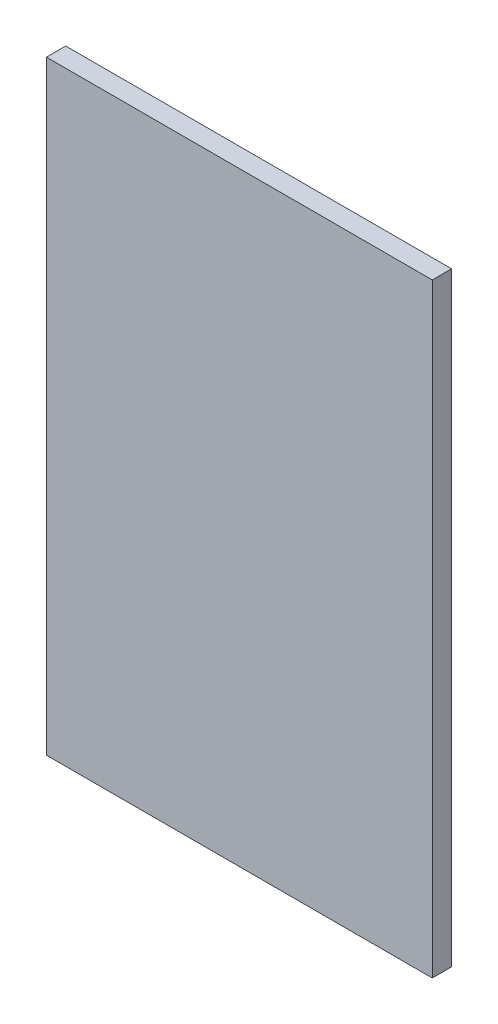
ISO-10303-21;
HEADER;
FILE_DESCRIPTION(('STEP AP214'),'2;1');
FILE_NAME('part.step','',(''),(''),'','','');
FILE_SCHEMA(('AUTOMOTIVE_DESIGN { 1 0 10303 214 1 1 1 1 }'));
ENDSEC;
DATA;
#1=APPLICATION_CONTEXT('core data for automotive mechanical design processes');
#2=APPLICATION_PROTOCOL_DEFINITION('international standard','automotive_design',2000,#1);
#3=PRODUCT_CONTEXT('',#1,'mechanical');
#4=PRODUCT('Part','Part','',(#3));
#5=PRODUCT_RELATED_PRODUCT_CATEGORY('part','',(#4));
#6=PRODUCT_DEFINITION_FORMATION('','',#4);
#7=PRODUCT_DEFINITION_CONTEXT('part definition',#1,'design');
#8=PRODUCT_DEFINITION('design','',#6,#7);
#9=PRODUCT_DEFINITION_SHAPE('','',#8);
#10=(LENGTH_UNIT() NAMED_UNIT(*) SI_UNIT(.MILLI.,.METRE.));
#11=(NAMED_UNIT(*) PLANE_ANGLE_UNIT() SI_UNIT($,.RADIAN.));
#12=(NAMED_UNIT(*) SI_UNIT($,.STERADIAN.) SOLID_ANGLE_UNIT());
#13=UNCERTAINTY_MEASURE_WITH_UNIT(LENGTH_MEASURE(1.E-05),#10,'distance_accuracy_value','');
#14=(GEOMETRIC_REPRESENTATION_CONTEXT(3) GLOBAL_UNCERTAINTY_ASSIGNED_CONTEXT((#13)) GLOBAL_UNIT_ASSIGNED_CONTEXT((#10,
#11,#12)) REPRESENTATION_CONTEXT('',''));
#15=CARTESIAN_POINT('',(0.,0.,0.));
#16=DIRECTION('',(0.,0.,1.));
#17=DIRECTION('',(1.,0.,0.));
#18=AXIS2_PLACEMENT_3D('',#15,#16,#17);
#19=CARTESIAN_POINT('',(0.,0.,1.5));
#20=DIRECTION('',(1.,0.,0.));
#21=DIRECTION('',(0.,0.,-1.));
#22=AXIS2_PLACEMENT_3D('',#19,#20,#21);
#23=PLANE('',#22);
#24=DIRECTION('',(0.,-1.,0.));
#25=VECTOR('',#24,1.);
#26=CARTESIAN_POINT('',(0.,0.,0.));
#27=LINE('',#26,#25);
#28=CARTESIAN_POINT('',(0.,47.,0.));
#29=VERTEX_POINT('',#28);
#30=CARTESIAN_POINT('',(0.,0.,0.));
#31=VERTEX_POINT('',#30);
#32=EDGE_CURVE('E102',#29,#31,#27,.T.);
#33=ORIENTED_EDGE('',*,*,#32,.T.);
#34=DIRECTION('',(0.,0.,-1.));
#35=VECTOR('',#34,1.);
#36=CARTESIAN_POINT('',(0.,0.,1.5));
#37=LINE('',#36,#35);
#38=CARTESIAN_POINT('',(0.,0.,1.5));
#39=VERTEX_POINT('',#38);
#40=EDGE_CURVE('E11',#39,#31,#37,.T.);
#41=ORIENTED_EDGE('',*,*,#40,.F.);
#42=DIRECTION('',(0.,-1.,0.));
#43=VECTOR('',#42,1.);
#44=CARTESIAN_POINT('',(0.,0.,1.5));
#45=LINE('',#44,#43);
#46=CARTESIAN_POINT('',(0.,47.,1.5));
#47=VERTEX_POINT('',#46);
#48=EDGE_CURVE('E90',#47,#39,#45,.T.);
#49=ORIENTED_EDGE('',*,*,#48,.F.);
#50=DIRECTION('',(0.,0.,-1.));
#51=VECTOR('',#50,1.);
#52=CARTESIAN_POINT('',(0.,47.,1.5));
#53=LINE('',#52,#51);
#54=EDGE_CURVE('E98',#47,#29,#53,.T.);
#55=ORIENTED_EDGE('',*,*,#54,.T.);
#56=EDGE_LOOP('',(#33,#41,#49,#55));
#57=FACE_BOUND('',#56,.T.);
#58=ADVANCED_FACE('F39',(#57),#23,.F.);
#59=CARTESIAN_POINT('',(0.,0.,1.5));
#60=DIRECTION('',(0.,1.,0.));
#61=DIRECTION('',(0.,0.,1.));
#62=AXIS2_PLACEMENT_3D('',#59,#60,#61);
#63=PLANE('',#62);
#64=DIRECTION('',(1.,0.,0.));
#65=VECTOR('',#64,1.);
#66=CARTESIAN_POINT('',(0.,0.,0.));
#67=LINE('',#66,#65);
#68=CARTESIAN_POINT('',(30.,0.,0.));
#69=VERTEX_POINT('',#68);
#70=EDGE_CURVE('E94',#31,#69,#67,.T.);
#71=ORIENTED_EDGE('',*,*,#70,.T.);
#72=DIRECTION('',(0.,0.,-1.));
#73=VECTOR('',#72,1.);
#74=CARTESIAN_POINT('',(30.,0.,1.5));
#75=LINE('',#74,#73);
#76=CARTESIAN_POINT('',(30.,0.,1.5));
#77=VERTEX_POINT('',#76);
#78=EDGE_CURVE('E47',#77,#69,#75,.T.);
#79=ORIENTED_EDGE('',*,*,#78,.F.);
#80=DIRECTION('',(1.,0.,0.));
#81=VECTOR('',#80,1.);
#82=CARTESIAN_POINT('',(0.,0.,1.5));
#83=LINE('',#82,#81);
#84=EDGE_CURVE('E85',#39,#77,#83,.T.);
#85=ORIENTED_EDGE('',*,*,#84,.F.);
#86=ORIENTED_EDGE('',*,*,#40,.T.);
#87=EDGE_LOOP('',(#71,#79,#85,#86));
#88=FACE_BOUND('',#87,.T.);
#89=ADVANCED_FACE('F93',(#88),#63,.F.);
#90=CARTESIAN_POINT('',(30.,0.,1.5));
#91=DIRECTION('',(-1.,0.,0.));
#92=DIRECTION('',(0.,0.,1.));
#93=AXIS2_PLACEMENT_3D('',#90,#91,#92);
#94=PLANE('',#93);
#95=DIRECTION('',(0.,1.,0.));
#96=VECTOR('',#95,1.);
#97=CARTESIAN_POINT('',(30.,0.,0.));
#98=LINE('',#97,#96);
#99=CARTESIAN_POINT('',(30.,47.,0.));
#100=VERTEX_POINT('',#99);
#101=EDGE_CURVE('E72',#69,#100,#98,.T.);
#102=ORIENTED_EDGE('',*,*,#101,.T.);
#103=DIRECTION('',(0.,0.,-1.));
#104=VECTOR('',#103,1.);
#105=CARTESIAN_POINT('',(30.,47.,1.5));
#106=LINE('',#105,#104);
#107=CARTESIAN_POINT('',(30.,47.,1.5));
#108=VERTEX_POINT('',#107);
#109=EDGE_CURVE('E95',#108,#100,#106,.T.);
#110=ORIENTED_EDGE('',*,*,#109,.F.);
#111=DIRECTION('',(0.,1.,0.));
#112=VECTOR('',#111,1.);
#113=CARTESIAN_POINT('',(30.,0.,1.5));
#114=LINE('',#113,#112);
#115=EDGE_CURVE('E88',#77,#108,#114,.T.);
#116=ORIENTED_EDGE('',*,*,#115,.F.);
#117=ORIENTED_EDGE('',*,*,#78,.T.);
#118=EDGE_LOOP('',(#102,#110,#116,#117));
#119=FACE_BOUND('',#118,.T.);
#120=ADVANCED_FACE('F96',(#119),#94,.F.);
#121=CARTESIAN_POINT('',(0.,47.,1.5));
#122=DIRECTION('',(0.,-1.,0.));
#123=DIRECTION('',(0.,0.,-1.));
#124=AXIS2_PLACEMENT_3D('',#121,#122,#123);
#125=PLANE('',#124);
#126=DIRECTION('',(-1.,0.,0.));
#127=VECTOR('',#126,1.);
#128=CARTESIAN_POINT('',(0.,47.,0.));
#129=LINE('',#128,#127);
#130=EDGE_CURVE('E78',#100,#29,#129,.T.);
#131=ORIENTED_EDGE('',*,*,#130,.T.);
#132=ORIENTED_EDGE('',*,*,#54,.F.);
#133=DIRECTION('',(-1.,0.,0.));
#134=VECTOR('',#133,1.);
#135=CARTESIAN_POINT('',(0.,47.,1.5));
#136=LINE('',#135,#134);
#137=EDGE_CURVE('E55',#108,#47,#136,.T.);
#138=ORIENTED_EDGE('',*,*,#137,.F.);
#139=ORIENTED_EDGE('',*,*,#109,.T.);
#140=EDGE_LOOP('',(#131,#132,#138,#139));
#141=FACE_BOUND('',#140,.T.);
#142=ADVANCED_FACE('F109',(#141),#125,.F.);
#143=CARTESIAN_POINT('',(0.,0.,1.5));
#144=DIRECTION('',(0.,0.,-1.));
#145=DIRECTION('',(-1.,0.,0.));
#146=AXIS2_PLACEMENT_3D('',#143,#144,#145);
#147=PLANE('',#146);
#148=ORIENTED_EDGE('',*,*,#48,.T.);
#149=ORIENTED_EDGE('',*,*,#84,.T.);
#150=ORIENTED_EDGE('',*,*,#115,.T.);
#151=ORIENTED_EDGE('',*,*,#137,.T.);
#152=EDGE_LOOP('',(#148,#149,#150,#151));
#153=FACE_BOUND('',#152,.T.);
#154=ADVANCED_FACE('F86',(#153),#147,.F.);
#155=CARTESIAN_POINT('',(0.,0.,0.));
#156=DIRECTION('',(0.,0.,-1.));
#157=DIRECTION('',(-1.,0.,0.));
#158=AXIS2_PLACEMENT_3D('',#155,#156,#157);
#159=PLANE('',#158);
#160=ORIENTED_EDGE('',*,*,#32,.F.);
#161=ORIENTED_EDGE('',*,*,#130,.F.);
#162=ORIENTED_EDGE('',*,*,#101,.F.);
#163=ORIENTED_EDGE('',*,*,#70,.F.);
#164=EDGE_LOOP('',(#160,#161,#162,#163));
#165=FACE_BOUND('',#164,.T.);
#166=ADVANCED_FACE('F112',(#165),#159,.T.);
#167=CLOSED_SHELL('',(#58,#89,#120,#142,#154,#166));
#168=MANIFOLD_SOLID_BREP('B2',#167);
#169=ADVANCED_BREP_SHAPE_REPRESENTATION('',(#18,#168),#14);
#170=SHAPE_DEFINITION_REPRESENTATION(#9,#169);
ENDSEC;
END-ISO-10303-21;
